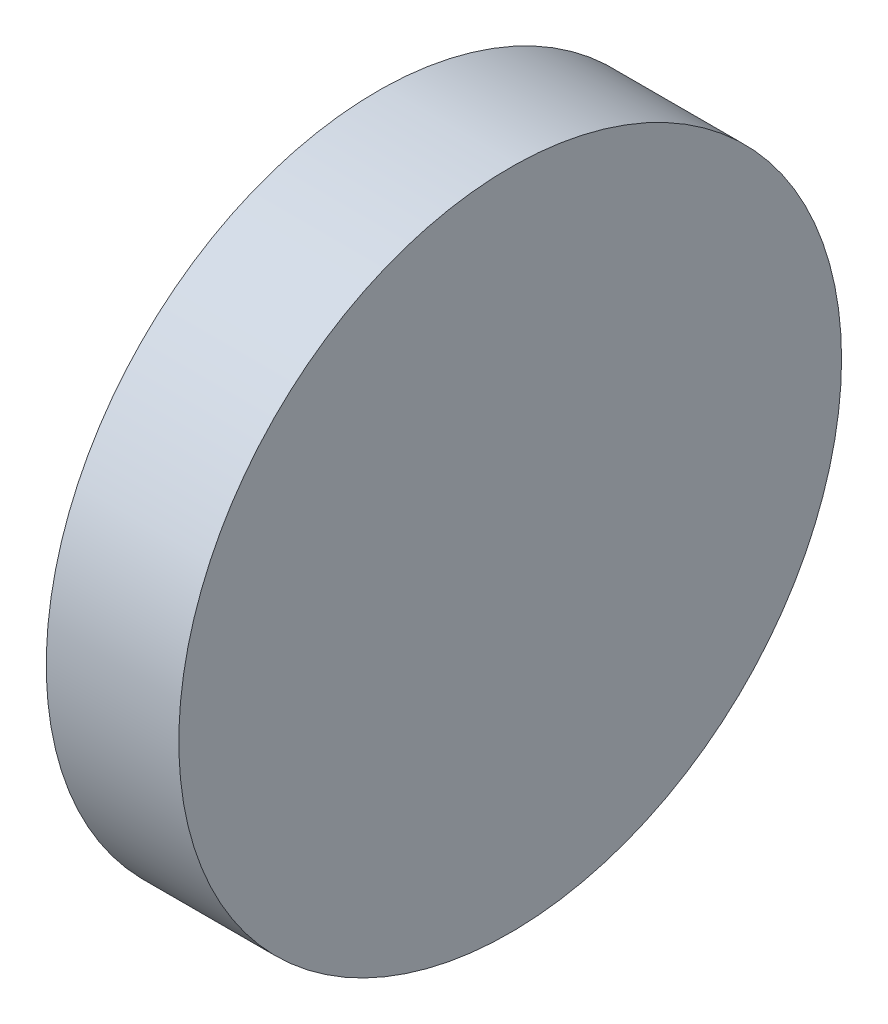
ISO-10303-21;
HEADER;
FILE_DESCRIPTION(('STEP AP214'),'2;1');
FILE_NAME('part.step','',(''),(''),'','','');
FILE_SCHEMA(('AUTOMOTIVE_DESIGN { 1 0 10303 214 1 1 1 1 }'));
ENDSEC;
DATA;
#1=APPLICATION_CONTEXT('core data for automotive mechanical design processes');
#2=APPLICATION_PROTOCOL_DEFINITION('international standard','automotive_design',2000,#1);
#3=PRODUCT_CONTEXT('',#1,'mechanical');
#4=PRODUCT('Part','Part','',(#3));
#5=PRODUCT_RELATED_PRODUCT_CATEGORY('part','',(#4));
#6=PRODUCT_DEFINITION_FORMATION('','',#4);
#7=PRODUCT_DEFINITION_CONTEXT('part definition',#1,'design');
#8=PRODUCT_DEFINITION('design','',#6,#7);
#9=PRODUCT_DEFINITION_SHAPE('','',#8);
#10=(LENGTH_UNIT() NAMED_UNIT(*) SI_UNIT(.MILLI.,.METRE.));
#11=(NAMED_UNIT(*) PLANE_ANGLE_UNIT() SI_UNIT($,.RADIAN.));
#12=(NAMED_UNIT(*) SI_UNIT($,.STERADIAN.) SOLID_ANGLE_UNIT());
#13=UNCERTAINTY_MEASURE_WITH_UNIT(LENGTH_MEASURE(1.E-05),#10,'distance_accuracy_value','');
#14=(GEOMETRIC_REPRESENTATION_CONTEXT(3) GLOBAL_UNCERTAINTY_ASSIGNED_CONTEXT((#13)) GLOBAL_UNIT_ASSIGNED_CONTEXT((#10,
#11,#12)) REPRESENTATION_CONTEXT('',''));
#15=CARTESIAN_POINT('',(0.,0.,0.));
#16=DIRECTION('',(0.,0.,1.));
#17=DIRECTION('',(1.,0.,0.));
#18=AXIS2_PLACEMENT_3D('',#15,#16,#17);
#19=CARTESIAN_POINT('',(2.,0.,0.));
#20=DIRECTION('',(-1.,0.,0.));
#21=DIRECTION('',(0.,0.,1.));
#22=AXIS2_PLACEMENT_3D('',#19,#20,#21);
#23=CYLINDRICAL_SURFACE('',#22,5.);
#24=CARTESIAN_POINT('',(2.,0.,0.));
#25=DIRECTION('',(1.,0.,0.));
#26=DIRECTION('',(0.,0.,-1.));
#27=AXIS2_PLACEMENT_3D('',#24,#25,#26);
#28=CIRCLE('',#27,5.);
#29=CARTESIAN_POINT('',(2.,0.,-5.));
#30=VERTEX_POINT('',#29);
#31=EDGE_CURVE('E10',#30,#30,#28,.T.);
#32=ORIENTED_EDGE('',*,*,#31,.F.);
#33=EDGE_LOOP('',(#32));
#34=FACE_BOUND('',#33,.T.);
#35=CARTESIAN_POINT('',(0.,0.,0.));
#36=DIRECTION('',(1.,0.,0.));
#37=DIRECTION('',(0.,0.,-1.));
#38=AXIS2_PLACEMENT_3D('',#35,#36,#37);
#39=CIRCLE('',#38,5.);
#40=CARTESIAN_POINT('',(0.,0.,-5.));
#41=VERTEX_POINT('',#40);
#42=EDGE_CURVE('E48',#41,#41,#39,.T.);
#43=ORIENTED_EDGE('',*,*,#42,.T.);
#44=EDGE_LOOP('',(#43));
#45=FACE_BOUND('',#44,.T.);
#46=ADVANCED_FACE('F45',(#34,#45),#23,.T.);
#47=CARTESIAN_POINT('',(2.,0.,0.));
#48=DIRECTION('',(1.,0.,0.));
#49=DIRECTION('',(0.,0.,-1.));
#50=AXIS2_PLACEMENT_3D('',#47,#48,#49);
#51=PLANE('',#50);
#52=ORIENTED_EDGE('',*,*,#31,.T.);
#53=EDGE_LOOP('',(#52));
#54=FACE_BOUND('',#53,.T.);
#55=ADVANCED_FACE('F110',(#54),#51,.T.);
#56=CARTESIAN_POINT('',(0.,0.,0.));
#57=DIRECTION('',(1.,0.,0.));
#58=DIRECTION('',(0.,0.,-1.));
#59=AXIS2_PLACEMENT_3D('',#56,#57,#58);
#60=PLANE('',#59);
#61=CARTESIAN_POINT('',(0.,0.,0.));
#62=DIRECTION('',(-1.,0.,0.));
#63=DIRECTION('',(0.,0.,1.));
#64=AXIS2_PLACEMENT_3D('',#61,#62,#63);
#65=CIRCLE('',#64,4.44242266495372);
#66=CARTESIAN_POINT('',(0.,0.,4.44242266495372));
#67=VERTEX_POINT('',#66);
#68=EDGE_CURVE('E57',#67,#67,#65,.T.);
#69=ORIENTED_EDGE('',*,*,#68,.F.);
#70=EDGE_LOOP('',(#69));
#71=FACE_BOUND('',#70,.T.);
#72=ORIENTED_EDGE('',*,*,#42,.F.);
#73=EDGE_LOOP('',(#72));
#74=FACE_BOUND('',#73,.T.);
#75=ADVANCED_FACE('F104',(#71,#74),#60,.F.);
#76=CARTESIAN_POINT('',(0.2,0.,0.));
#77=DIRECTION('',(-1.,0.,0.));
#78=DIRECTION('',(0.,0.,1.));
#79=AXIS2_PLACEMENT_3D('',#76,#77,#78);
#80=CYLINDRICAL_SURFACE('',#79,4.44242266495372);
#81=CARTESIAN_POINT('',(0.2,0.,0.));
#82=DIRECTION('',(-1.,0.,0.));
#83=DIRECTION('',(0.,0.,1.));
#84=AXIS2_PLACEMENT_3D('',#81,#82,#83);
#85=CIRCLE('',#84,4.44242266495372);
#86=CARTESIAN_POINT('',(0.2,0.,4.44242266495372));
#87=VERTEX_POINT('',#86);
#88=EDGE_CURVE('E55',#87,#87,#85,.T.);
#89=ORIENTED_EDGE('',*,*,#88,.F.);
#90=EDGE_LOOP('',(#89));
#91=FACE_BOUND('',#90,.T.);
#92=ORIENTED_EDGE('',*,*,#68,.T.);
#93=EDGE_LOOP('',(#92));
#94=FACE_BOUND('',#93,.T.);
#95=ADVANCED_FACE('F98',(#91,#94),#80,.F.);
#96=CARTESIAN_POINT('',(0.2,0.,0.));
#97=DIRECTION('',(-1.,0.,0.));
#98=DIRECTION('',(0.,0.,1.));
#99=AXIS2_PLACEMENT_3D('',#96,#97,#98);
#100=PLANE('',#99);
#101=CARTESIAN_POINT('',(0.2,0.,0.));
#102=DIRECTION('',(-1.,0.,0.));
#103=DIRECTION('',(0.,0.,1.));
#104=AXIS2_PLACEMENT_3D('',#101,#102,#103);
#105=CIRCLE('',#104,0.759565490216124);
#106=CARTESIAN_POINT('',(0.2,0.,0.759565490216124));
#107=VERTEX_POINT('',#106);
#108=EDGE_CURVE('E63',#107,#107,#105,.T.);
#109=ORIENTED_EDGE('',*,*,#108,.F.);
#110=EDGE_LOOP('',(#109));
#111=FACE_BOUND('',#110,.T.);
#112=ORIENTED_EDGE('',*,*,#88,.T.);
#113=EDGE_LOOP('',(#112));
#114=FACE_BOUND('',#113,.T.);
#115=ADVANCED_FACE('F92',(#111,#114),#100,.T.);
#116=CARTESIAN_POINT('',(0.8,0.,0.));
#117=DIRECTION('',(-1.,0.,0.));
#118=DIRECTION('',(0.,0.,1.));
#119=AXIS2_PLACEMENT_3D('',#116,#117,#118);
#120=CYLINDRICAL_SURFACE('',#119,0.759565490216124);
#121=CARTESIAN_POINT('',(0.8,0.,0.));
#122=DIRECTION('',(-1.,0.,0.));
#123=DIRECTION('',(0.,0.,1.));
#124=AXIS2_PLACEMENT_3D('',#121,#122,#123);
#125=CIRCLE('',#124,0.759565490216124);
#126=CARTESIAN_POINT('',(0.8,0.,0.759565490216124));
#127=VERTEX_POINT('',#126);
#128=EDGE_CURVE('E60',#127,#127,#125,.T.);
#129=ORIENTED_EDGE('',*,*,#128,.F.);
#130=EDGE_LOOP('',(#129));
#131=FACE_BOUND('',#130,.T.);
#132=ORIENTED_EDGE('',*,*,#108,.T.);
#133=EDGE_LOOP('',(#132));
#134=FACE_BOUND('',#133,.T.);
#135=ADVANCED_FACE('F86',(#131,#134),#120,.F.);
#136=CARTESIAN_POINT('',(0.8,0.,0.));
#137=DIRECTION('',(-1.,0.,0.));
#138=DIRECTION('',(0.,0.,1.));
#139=AXIS2_PLACEMENT_3D('',#136,#137,#138);
#140=PLANE('',#139);
#141=CARTESIAN_POINT('',(0.8,0.,0.));
#142=DIRECTION('',(-1.,0.,0.));
#143=DIRECTION('',(0.,0.,1.));
#144=AXIS2_PLACEMENT_3D('',#141,#142,#143);
#145=CIRCLE('',#144,0.278093264550351);
#146=CARTESIAN_POINT('',(0.8,0.,0.278093264550351));
#147=VERTEX_POINT('',#146);
#148=EDGE_CURVE('E69',#147,#147,#145,.T.);
#149=ORIENTED_EDGE('',*,*,#148,.F.);
#150=EDGE_LOOP('',(#149));
#151=FACE_BOUND('',#150,.T.);
#152=ORIENTED_EDGE('',*,*,#128,.T.);
#153=EDGE_LOOP('',(#152));
#154=FACE_BOUND('',#153,.T.);
#155=ADVANCED_FACE('F80',(#151,#154),#140,.T.);
#156=CARTESIAN_POINT('',(1.4,0.,0.));
#157=DIRECTION('',(-1.,0.,0.));
#158=DIRECTION('',(0.,0.,1.));
#159=AXIS2_PLACEMENT_3D('',#156,#157,#158);
#160=CYLINDRICAL_SURFACE('',#159,0.278093264550351);
#161=CARTESIAN_POINT('',(1.4,0.,0.));
#162=DIRECTION('',(-1.,0.,0.));
#163=DIRECTION('',(0.,0.,1.));
#164=AXIS2_PLACEMENT_3D('',#161,#162,#163);
#165=CIRCLE('',#164,0.278093264550351);
#166=CARTESIAN_POINT('',(1.4,0.,0.278093264550351));
#167=VERTEX_POINT('',#166);
#168=EDGE_CURVE('E66',#167,#167,#165,.T.);
#169=ORIENTED_EDGE('',*,*,#168,.F.);
#170=EDGE_LOOP('',(#169));
#171=FACE_BOUND('',#170,.T.);
#172=ORIENTED_EDGE('',*,*,#148,.T.);
#173=EDGE_LOOP('',(#172));
#174=FACE_BOUND('',#173,.T.);
#175=ADVANCED_FACE('F77',(#171,#174),#160,.F.);
#176=CARTESIAN_POINT('',(1.4,0.,0.));
#177=DIRECTION('',(-1.,0.,0.));
#178=DIRECTION('',(0.,0.,1.));
#179=AXIS2_PLACEMENT_3D('',#176,#177,#178);
#180=PLANE('',#179);
#181=ORIENTED_EDGE('',*,*,#168,.T.);
#182=EDGE_LOOP('',(#181));
#183=FACE_BOUND('',#182,.T.);
#184=ADVANCED_FACE('F75',(#183),#180,.T.);
#185=CLOSED_SHELL('',(#46,#55,#75,#95,#115,#135,#155,#175,#184));
#186=MANIFOLD_SOLID_BREP('B2',#185);
#187=ADVANCED_BREP_SHAPE_REPRESENTATION('',(#18,#186),#14);
#188=SHAPE_DEFINITION_REPRESENTATION(#9,#187);
ENDSEC;
END-ISO-10303-21;
